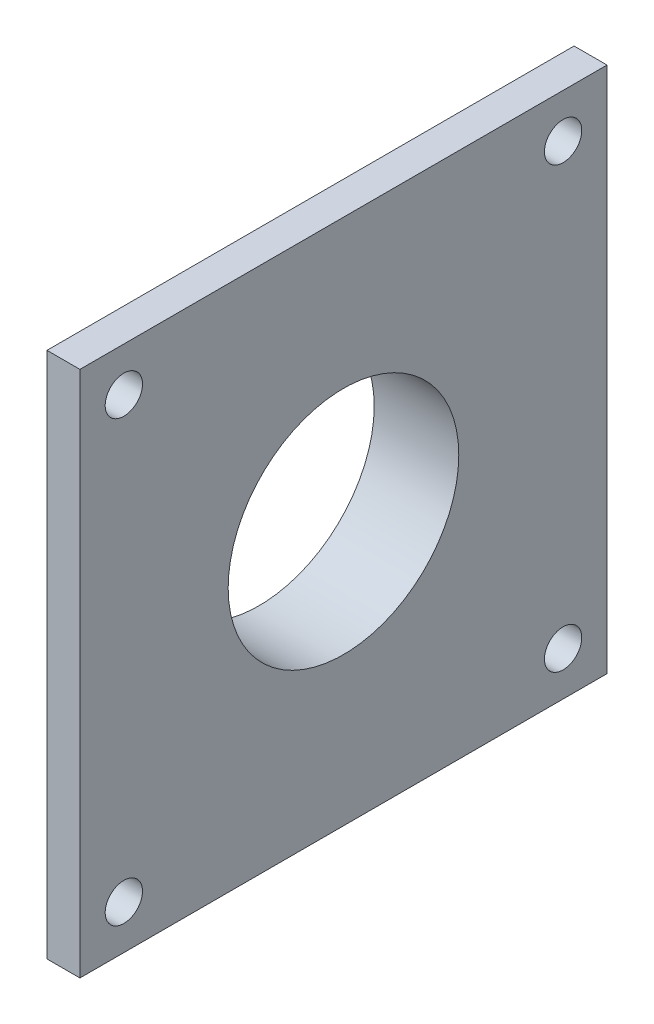
ISO-10303-21;
HEADER;
FILE_DESCRIPTION(('STEP AP214'),'2;1');
FILE_NAME('part.step','',(''),(''),'','','');
FILE_SCHEMA(('AUTOMOTIVE_DESIGN { 1 0 10303 214 1 1 1 1 }'));
ENDSEC;
DATA;
#1=APPLICATION_CONTEXT('core data for automotive mechanical design processes');
#2=APPLICATION_PROTOCOL_DEFINITION('international standard','automotive_design',2000,#1);
#3=PRODUCT_CONTEXT('',#1,'mechanical');
#4=PRODUCT('Part','Part','',(#3));
#5=PRODUCT_RELATED_PRODUCT_CATEGORY('part','',(#4));
#6=PRODUCT_DEFINITION_FORMATION('','',#4);
#7=PRODUCT_DEFINITION_CONTEXT('part definition',#1,'design');
#8=PRODUCT_DEFINITION('design','',#6,#7);
#9=PRODUCT_DEFINITION_SHAPE('','',#8);
#10=(LENGTH_UNIT() NAMED_UNIT(*) SI_UNIT(.MILLI.,.METRE.));
#11=(NAMED_UNIT(*) PLANE_ANGLE_UNIT() SI_UNIT($,.RADIAN.));
#12=(NAMED_UNIT(*) SI_UNIT($,.STERADIAN.) SOLID_ANGLE_UNIT());
#13=UNCERTAINTY_MEASURE_WITH_UNIT(LENGTH_MEASURE(1.E-05),#10,'distance_accuracy_value','');
#14=(GEOMETRIC_REPRESENTATION_CONTEXT(3) GLOBAL_UNCERTAINTY_ASSIGNED_CONTEXT((#13)) GLOBAL_UNIT_ASSIGNED_CONTEXT((#10,
#11,#12)) REPRESENTATION_CONTEXT('',''));
#15=CARTESIAN_POINT('',(0.,0.,0.));
#16=DIRECTION('',(0.,0.,1.));
#17=DIRECTION('',(1.,0.,0.));
#18=AXIS2_PLACEMENT_3D('',#15,#16,#17);
#19=CARTESIAN_POINT('',(4.7122,24.,24.));
#20=DIRECTION('',(-1.,0.,0.));
#21=DIRECTION('',(0.,0.,1.));
#22=AXIS2_PLACEMENT_3D('',#19,#20,#21);
#23=CYLINDRICAL_SURFACE('',#22,17.5);
#24=CARTESIAN_POINT('',(4.7122,24.,24.));
#25=DIRECTION('',(-1.,0.,0.));
#26=DIRECTION('',(0.,0.,1.));
#27=AXIS2_PLACEMENT_3D('',#24,#25,#26);
#28=CIRCLE('',#27,17.5);
#29=CARTESIAN_POINT('',(4.7122,24.,41.5));
#30=VERTEX_POINT('',#29);
#31=EDGE_CURVE('E73',#30,#30,#28,.F.);
#32=ORIENTED_EDGE('',*,*,#31,.F.);
#33=EDGE_LOOP('',(#32));
#34=FACE_BOUND('',#33,.T.);
#35=CARTESIAN_POINT('',(0.0122000000000099,24.,24.));
#36=DIRECTION('',(-1.,0.,0.));
#37=DIRECTION('',(0.,0.,1.));
#38=AXIS2_PLACEMENT_3D('',#35,#36,#37);
#39=CIRCLE('',#38,17.5);
#40=CARTESIAN_POINT('',(0.0122000000000099,24.,41.5));
#41=VERTEX_POINT('',#40);
#42=EDGE_CURVE('E19',#41,#41,#39,.T.);
#43=ORIENTED_EDGE('',*,*,#42,.F.);
#44=EDGE_LOOP('',(#43));
#45=FACE_BOUND('',#44,.T.);
#46=ADVANCED_FACE('F16',(#34,#45),#23,.T.);
#47=CARTESIAN_POINT('',(0.01220000000001,24.,24.));
#48=DIRECTION('',(-1.,0.,0.));
#49=DIRECTION('',(0.,0.,1.));
#50=AXIS2_PLACEMENT_3D('',#47,#48,#49);
#51=PLANE('',#50);
#52=CARTESIAN_POINT('',(0.0122000000000099,24.,24.));
#53=DIRECTION('',(-1.,0.,0.));
#54=DIRECTION('',(0.,0.,1.));
#55=AXIS2_PLACEMENT_3D('',#52,#53,#54);
#56=CIRCLE('',#55,10.5);
#57=CARTESIAN_POINT('',(0.0122000000000099,24.,34.5));
#58=VERTEX_POINT('',#57);
#59=EDGE_CURVE('E98',#58,#58,#56,.F.);
#60=ORIENTED_EDGE('',*,*,#59,.T.);
#61=EDGE_LOOP('',(#60));
#62=FACE_BOUND('',#61,.T.);
#63=ORIENTED_EDGE('',*,*,#42,.T.);
#64=EDGE_LOOP('',(#63));
#65=FACE_BOUND('',#64,.T.);
#66=ADVANCED_FACE('F115',(#62,#65),#51,.T.);
#67=CARTESIAN_POINT('',(4.7122,0.,0.));
#68=DIRECTION('',(-1.,0.,0.));
#69=DIRECTION('',(0.,0.,1.));
#70=AXIS2_PLACEMENT_3D('',#67,#68,#69);
#71=PLANE('',#70);
#72=CARTESIAN_POINT('',(4.7122,4.,44.));
#73=DIRECTION('',(-1.,0.,0.));
#74=DIRECTION('',(0.,0.,1.));
#75=AXIS2_PLACEMENT_3D('',#72,#73,#74);
#76=CIRCLE('',#75,1.7);
#77=CARTESIAN_POINT('',(4.7122,4.,45.7));
#78=VERTEX_POINT('',#77);
#79=EDGE_CURVE('E95',#78,#78,#76,.F.);
#80=ORIENTED_EDGE('',*,*,#79,.T.);
#81=EDGE_LOOP('',(#80));
#82=FACE_BOUND('',#81,.T.);
#83=ORIENTED_EDGE('',*,*,#31,.T.);
#84=EDGE_LOOP('',(#83));
#85=FACE_BOUND('',#84,.T.);
#86=CARTESIAN_POINT('',(4.7122,4.,4.));
#87=DIRECTION('',(-1.,0.,0.));
#88=DIRECTION('',(0.,0.,1.));
#89=AXIS2_PLACEMENT_3D('',#86,#87,#88);
#90=CIRCLE('',#89,1.7);
#91=CARTESIAN_POINT('',(4.7122,4.,5.7));
#92=VERTEX_POINT('',#91);
#93=EDGE_CURVE('E101',#92,#92,#90,.F.);
#94=ORIENTED_EDGE('',*,*,#93,.T.);
#95=EDGE_LOOP('',(#94));
#96=FACE_BOUND('',#95,.T.);
#97=CARTESIAN_POINT('',(4.7122,44.,44.));
#98=DIRECTION('',(-1.,0.,0.));
#99=DIRECTION('',(0.,0.,1.));
#100=AXIS2_PLACEMENT_3D('',#97,#98,#99);
#101=CIRCLE('',#100,1.7);
#102=CARTESIAN_POINT('',(4.7122,44.,45.7));
#103=VERTEX_POINT('',#102);
#104=EDGE_CURVE('E104',#103,#103,#101,.F.);
#105=ORIENTED_EDGE('',*,*,#104,.T.);
#106=EDGE_LOOP('',(#105));
#107=FACE_BOUND('',#106,.T.);
#108=CARTESIAN_POINT('',(4.7122,44.,4.));
#109=DIRECTION('',(-1.,0.,0.));
#110=DIRECTION('',(0.,0.,1.));
#111=AXIS2_PLACEMENT_3D('',#108,#109,#110);
#112=CIRCLE('',#111,1.7);
#113=CARTESIAN_POINT('',(4.7122,44.,5.7));
#114=VERTEX_POINT('',#113);
#115=EDGE_CURVE('E107',#114,#114,#112,.F.);
#116=ORIENTED_EDGE('',*,*,#115,.T.);
#117=EDGE_LOOP('',(#116));
#118=FACE_BOUND('',#117,.T.);
#119=DIRECTION('',(0.,1.,0.));
#120=VECTOR('',#119,1.);
#121=CARTESIAN_POINT('',(4.7122,0.,0.));
#122=LINE('',#121,#120);
#123=CARTESIAN_POINT('',(4.7122,48.,0.));
#124=VERTEX_POINT('',#123);
#125=CARTESIAN_POINT('',(4.7122,0.,0.));
#126=VERTEX_POINT('',#125);
#127=EDGE_CURVE('E79',#124,#126,#122,.F.);
#128=ORIENTED_EDGE('',*,*,#127,.T.);
#129=DIRECTION('',(0.,0.,1.));
#130=VECTOR('',#129,1.);
#131=CARTESIAN_POINT('',(4.7122,0.,0.));
#132=LINE('',#131,#130);
#133=CARTESIAN_POINT('',(4.7122,0.,48.));
#134=VERTEX_POINT('',#133);
#135=EDGE_CURVE('E69',#126,#134,#132,.T.);
#136=ORIENTED_EDGE('',*,*,#135,.T.);
#137=DIRECTION('',(0.,1.,0.));
#138=VECTOR('',#137,1.);
#139=CARTESIAN_POINT('',(4.7122,0.,48.));
#140=LINE('',#139,#138);
#141=CARTESIAN_POINT('',(4.7122,48.,48.));
#142=VERTEX_POINT('',#141);
#143=EDGE_CURVE('E65',#142,#134,#140,.F.);
#144=ORIENTED_EDGE('',*,*,#143,.F.);
#145=DIRECTION('',(0.,0.,1.));
#146=VECTOR('',#145,1.);
#147=CARTESIAN_POINT('',(4.7122,48.,0.));
#148=LINE('',#147,#146);
#149=EDGE_CURVE('E55',#124,#142,#148,.T.);
#150=ORIENTED_EDGE('',*,*,#149,.F.);
#151=EDGE_LOOP('',(#128,#136,#144,#150));
#152=FACE_BOUND('',#151,.T.);
#153=ADVANCED_FACE('F68',(#82,#85,#96,#107,#118,#152),#71,.T.);
#154=CARTESIAN_POINT('',(7.7122,0.,48.));
#155=DIRECTION('',(0.,0.,1.));
#156=DIRECTION('',(1.,0.,0.));
#157=AXIS2_PLACEMENT_3D('',#154,#155,#156);
#158=PLANE('',#157);
#159=DIRECTION('',(1.,0.,0.));
#160=VECTOR('',#159,1.);
#161=CARTESIAN_POINT('',(7.7122,0.,48.));
#162=LINE('',#161,#160);
#163=CARTESIAN_POINT('',(7.7122,0.,48.));
#164=VERTEX_POINT('',#163);
#165=EDGE_CURVE('E261',#134,#164,#162,.T.);
#166=ORIENTED_EDGE('',*,*,#165,.T.);
#167=DIRECTION('',(0.,1.,0.));
#168=VECTOR('',#167,1.);
#169=CARTESIAN_POINT('',(7.7122,0.,48.));
#170=LINE('',#169,#168);
#171=CARTESIAN_POINT('',(7.7122,48.,48.));
#172=VERTEX_POINT('',#171);
#173=EDGE_CURVE('E77',#164,#172,#170,.T.);
#174=ORIENTED_EDGE('',*,*,#173,.T.);
#175=DIRECTION('',(1.,0.,0.));
#176=VECTOR('',#175,1.);
#177=CARTESIAN_POINT('',(7.7122,48.,48.));
#178=LINE('',#177,#176);
#179=EDGE_CURVE('E62',#142,#172,#178,.T.);
#180=ORIENTED_EDGE('',*,*,#179,.F.);
#181=ORIENTED_EDGE('',*,*,#143,.T.);
#182=EDGE_LOOP('',(#166,#174,#180,#181));
#183=FACE_BOUND('',#182,.T.);
#184=ADVANCED_FACE('F76',(#183),#158,.T.);
#185=CARTESIAN_POINT('',(7.7122,48.,0.));
#186=DIRECTION('',(0.,1.,0.));
#187=DIRECTION('',(0.,0.,1.));
#188=AXIS2_PLACEMENT_3D('',#185,#186,#187);
#189=PLANE('',#188);
#190=DIRECTION('',(0.,0.,1.));
#191=VECTOR('',#190,1.);
#192=CARTESIAN_POINT('',(7.7122,48.,0.));
#193=LINE('',#192,#191);
#194=CARTESIAN_POINT('',(7.7122,48.,0.));
#195=VERTEX_POINT('',#194);
#196=EDGE_CURVE('E267',#172,#195,#193,.F.);
#197=ORIENTED_EDGE('',*,*,#196,.T.);
#198=DIRECTION('',(1.,0.,0.));
#199=VECTOR('',#198,1.);
#200=CARTESIAN_POINT('',(7.7122,48.,0.));
#201=LINE('',#200,#199);
#202=EDGE_CURVE('E64',#195,#124,#201,.F.);
#203=ORIENTED_EDGE('',*,*,#202,.T.);
#204=ORIENTED_EDGE('',*,*,#149,.T.);
#205=ORIENTED_EDGE('',*,*,#179,.T.);
#206=EDGE_LOOP('',(#197,#203,#204,#205));
#207=FACE_BOUND('',#206,.T.);
#208=ADVANCED_FACE('F60',(#207),#189,.T.);
#209=CARTESIAN_POINT('',(7.7122,0.,0.));
#210=DIRECTION('',(0.,0.,1.));
#211=DIRECTION('',(1.,0.,0.));
#212=AXIS2_PLACEMENT_3D('',#209,#210,#211);
#213=PLANE('',#212);
#214=DIRECTION('',(1.,0.,0.));
#215=VECTOR('',#214,1.);
#216=CARTESIAN_POINT('',(7.7122,0.,0.));
#217=LINE('',#216,#215);
#218=CARTESIAN_POINT('',(7.7122,0.,0.));
#219=VERTEX_POINT('',#218);
#220=EDGE_CURVE('E34',#219,#126,#217,.F.);
#221=ORIENTED_EDGE('',*,*,#220,.T.);
#222=ORIENTED_EDGE('',*,*,#127,.F.);
#223=ORIENTED_EDGE('',*,*,#202,.F.);
#224=DIRECTION('',(0.,1.,0.));
#225=VECTOR('',#224,1.);
#226=CARTESIAN_POINT('',(7.7122,0.,0.));
#227=LINE('',#226,#225);
#228=EDGE_CURVE('E260',#195,#219,#227,.F.);
#229=ORIENTED_EDGE('',*,*,#228,.T.);
#230=EDGE_LOOP('',(#221,#222,#223,#229));
#231=FACE_BOUND('',#230,.T.);
#232=ADVANCED_FACE('F156',(#231),#213,.F.);
#233=CARTESIAN_POINT('',(7.7122,0.,0.));
#234=DIRECTION('',(0.,1.,0.));
#235=DIRECTION('',(0.,0.,1.));
#236=AXIS2_PLACEMENT_3D('',#233,#234,#235);
#237=PLANE('',#236);
#238=DIRECTION('',(0.,0.,1.));
#239=VECTOR('',#238,1.);
#240=CARTESIAN_POINT('',(7.7122,0.,0.));
#241=LINE('',#240,#239);
#242=EDGE_CURVE('E94',#219,#164,#241,.T.);
#243=ORIENTED_EDGE('',*,*,#242,.T.);
#244=ORIENTED_EDGE('',*,*,#165,.F.);
#245=ORIENTED_EDGE('',*,*,#135,.F.);
#246=ORIENTED_EDGE('',*,*,#220,.F.);
#247=EDGE_LOOP('',(#243,#244,#245,#246));
#248=FACE_BOUND('',#247,.T.);
#249=ADVANCED_FACE('F152',(#248),#237,.F.);
#250=CARTESIAN_POINT('',(7.7122,44.,4.));
#251=DIRECTION('',(-1.,0.,0.));
#252=DIRECTION('',(0.,0.,1.));
#253=AXIS2_PLACEMENT_3D('',#250,#251,#252);
#254=CYLINDRICAL_SURFACE('',#253,1.7);
#255=CARTESIAN_POINT('',(7.7122,44.,4.));
#256=DIRECTION('',(-1.,0.,0.));
#257=DIRECTION('',(0.,0.,1.));
#258=AXIS2_PLACEMENT_3D('',#255,#256,#257);
#259=CIRCLE('',#258,1.7);
#260=CARTESIAN_POINT('',(7.7122,44.,5.7));
#261=VERTEX_POINT('',#260);
#262=EDGE_CURVE('E91',#261,#261,#259,.F.);
#263=ORIENTED_EDGE('',*,*,#262,.T.);
#264=EDGE_LOOP('',(#263));
#265=FACE_BOUND('',#264,.T.);
#266=ORIENTED_EDGE('',*,*,#115,.F.);
#267=EDGE_LOOP('',(#266));
#268=FACE_BOUND('',#267,.T.);
#269=ADVANCED_FACE('F148',(#265,#268),#254,.F.);
#270=CARTESIAN_POINT('',(7.7122,44.,44.));
#271=DIRECTION('',(-1.,0.,0.));
#272=DIRECTION('',(0.,0.,1.));
#273=AXIS2_PLACEMENT_3D('',#270,#271,#272);
#274=CYLINDRICAL_SURFACE('',#273,1.7);
#275=CARTESIAN_POINT('',(7.7122,44.,44.));
#276=DIRECTION('',(-1.,0.,0.));
#277=DIRECTION('',(0.,0.,1.));
#278=AXIS2_PLACEMENT_3D('',#275,#276,#277);
#279=CIRCLE('',#278,1.7);
#280=CARTESIAN_POINT('',(7.7122,44.,45.7));
#281=VERTEX_POINT('',#280);
#282=EDGE_CURVE('E88',#281,#281,#279,.F.);
#283=ORIENTED_EDGE('',*,*,#282,.T.);
#284=EDGE_LOOP('',(#283));
#285=FACE_BOUND('',#284,.T.);
#286=ORIENTED_EDGE('',*,*,#104,.F.);
#287=EDGE_LOOP('',(#286));
#288=FACE_BOUND('',#287,.T.);
#289=ADVANCED_FACE('F144',(#285,#288),#274,.F.);
#290=CARTESIAN_POINT('',(7.7122,4.,4.));
#291=DIRECTION('',(-1.,0.,0.));
#292=DIRECTION('',(0.,0.,1.));
#293=AXIS2_PLACEMENT_3D('',#290,#291,#292);
#294=CYLINDRICAL_SURFACE('',#293,1.7);
#295=CARTESIAN_POINT('',(7.7122,4.,4.));
#296=DIRECTION('',(-1.,0.,0.));
#297=DIRECTION('',(0.,0.,1.));
#298=AXIS2_PLACEMENT_3D('',#295,#296,#297);
#299=CIRCLE('',#298,1.7);
#300=CARTESIAN_POINT('',(7.7122,4.,5.7));
#301=VERTEX_POINT('',#300);
#302=EDGE_CURVE('E85',#301,#301,#299,.F.);
#303=ORIENTED_EDGE('',*,*,#302,.T.);
#304=EDGE_LOOP('',(#303));
#305=FACE_BOUND('',#304,.T.);
#306=ORIENTED_EDGE('',*,*,#93,.F.);
#307=EDGE_LOOP('',(#306));
#308=FACE_BOUND('',#307,.T.);
#309=ADVANCED_FACE('F140',(#305,#308),#294,.F.);
#310=CARTESIAN_POINT('',(7.7122,24.,24.));
#311=DIRECTION('',(-1.,0.,0.));
#312=DIRECTION('',(0.,0.,1.));
#313=AXIS2_PLACEMENT_3D('',#310,#311,#312);
#314=CYLINDRICAL_SURFACE('',#313,10.5);
#315=CARTESIAN_POINT('',(7.7122,24.,24.));
#316=DIRECTION('',(-1.,0.,0.));
#317=DIRECTION('',(0.,0.,1.));
#318=AXIS2_PLACEMENT_3D('',#315,#316,#317);
#319=CIRCLE('',#318,10.5);
#320=CARTESIAN_POINT('',(7.7122,24.,34.5));
#321=VERTEX_POINT('',#320);
#322=EDGE_CURVE('E25',#321,#321,#319,.F.);
#323=ORIENTED_EDGE('',*,*,#322,.T.);
#324=EDGE_LOOP('',(#323));
#325=FACE_BOUND('',#324,.T.);
#326=ORIENTED_EDGE('',*,*,#59,.F.);
#327=EDGE_LOOP('',(#326));
#328=FACE_BOUND('',#327,.T.);
#329=ADVANCED_FACE('F132',(#325,#328),#314,.F.);
#330=CARTESIAN_POINT('',(7.7122,4.,44.));
#331=DIRECTION('',(-1.,0.,0.));
#332=DIRECTION('',(0.,0.,1.));
#333=AXIS2_PLACEMENT_3D('',#330,#331,#332);
#334=CYLINDRICAL_SURFACE('',#333,1.7);
#335=CARTESIAN_POINT('',(7.7122,4.,44.));
#336=DIRECTION('',(-1.,0.,0.));
#337=DIRECTION('',(0.,0.,1.));
#338=AXIS2_PLACEMENT_3D('',#335,#336,#337);
#339=CIRCLE('',#338,1.7);
#340=CARTESIAN_POINT('',(7.7122,4.,45.7));
#341=VERTEX_POINT('',#340);
#342=EDGE_CURVE('E11',#341,#341,#339,.F.);
#343=ORIENTED_EDGE('',*,*,#342,.T.);
#344=EDGE_LOOP('',(#343));
#345=FACE_BOUND('',#344,.T.);
#346=ORIENTED_EDGE('',*,*,#79,.F.);
#347=EDGE_LOOP('',(#346));
#348=FACE_BOUND('',#347,.T.);
#349=ADVANCED_FACE('F126',(#345,#348),#334,.F.);
#350=CARTESIAN_POINT('',(7.7122,0.,0.));
#351=DIRECTION('',(-1.,0.,0.));
#352=DIRECTION('',(0.,0.,1.));
#353=AXIS2_PLACEMENT_3D('',#350,#351,#352);
#354=PLANE('',#353);
#355=ORIENTED_EDGE('',*,*,#342,.F.);
#356=EDGE_LOOP('',(#355));
#357=FACE_BOUND('',#356,.T.);
#358=ORIENTED_EDGE('',*,*,#322,.F.);
#359=EDGE_LOOP('',(#358));
#360=FACE_BOUND('',#359,.T.);
#361=ORIENTED_EDGE('',*,*,#302,.F.);
#362=EDGE_LOOP('',(#361));
#363=FACE_BOUND('',#362,.T.);
#364=ORIENTED_EDGE('',*,*,#282,.F.);
#365=EDGE_LOOP('',(#364));
#366=FACE_BOUND('',#365,.T.);
#367=ORIENTED_EDGE('',*,*,#262,.F.);
#368=EDGE_LOOP('',(#367));
#369=FACE_BOUND('',#368,.T.);
#370=ORIENTED_EDGE('',*,*,#228,.F.);
#371=ORIENTED_EDGE('',*,*,#196,.F.);
#372=ORIENTED_EDGE('',*,*,#173,.F.);
#373=ORIENTED_EDGE('',*,*,#242,.F.);
#374=EDGE_LOOP('',(#370,#371,#372,#373));
#375=FACE_BOUND('',#374,.T.);
#376=ADVANCED_FACE('F124',(#357,#360,#363,#366,#369,#375),#354,.F.);
#377=CLOSED_SHELL('',(#46,#66,#153,#184,#208,#232,#249,#269,#289,#309,#329,#349,#376));
#378=MANIFOLD_SOLID_BREP('B1',#377);
#379=ADVANCED_BREP_SHAPE_REPRESENTATION('',(#18,#378),#14);
#380=SHAPE_DEFINITION_REPRESENTATION(#9,#379);
ENDSEC;
END-ISO-10303-21;
